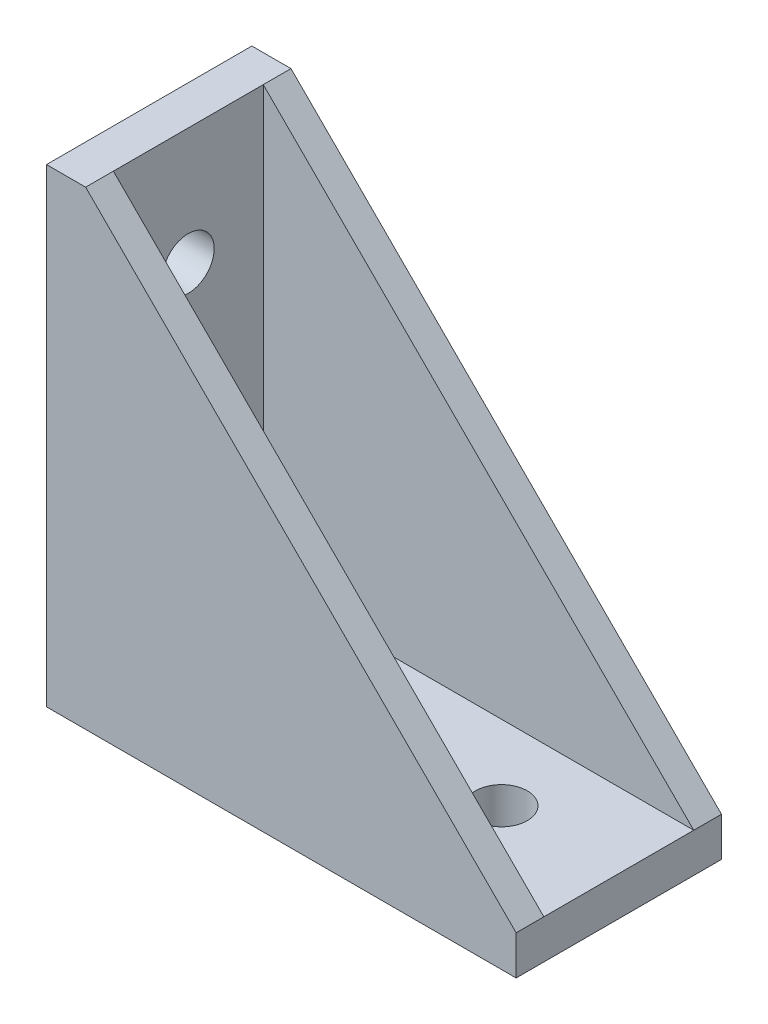
ISO-10303-21;
HEADER;
FILE_DESCRIPTION(('STEP AP214'),'2;1');
FILE_NAME('part.step','',(''),(''),'','','');
FILE_SCHEMA(('AUTOMOTIVE_DESIGN { 1 0 10303 214 1 1 1 1 }'));
ENDSEC;
DATA;
#1=APPLICATION_CONTEXT('core data for automotive mechanical design processes');
#2=APPLICATION_PROTOCOL_DEFINITION('international standard','automotive_design',2000,#1);
#3=PRODUCT_CONTEXT('',#1,'mechanical');
#4=PRODUCT('Part','Part','',(#3));
#5=PRODUCT_RELATED_PRODUCT_CATEGORY('part','',(#4));
#6=PRODUCT_DEFINITION_FORMATION('','',#4);
#7=PRODUCT_DEFINITION_CONTEXT('part definition',#1,'design');
#8=PRODUCT_DEFINITION('design','',#6,#7);
#9=PRODUCT_DEFINITION_SHAPE('','',#8);
#10=(LENGTH_UNIT() NAMED_UNIT(*) SI_UNIT(.MILLI.,.METRE.));
#11=(NAMED_UNIT(*) PLANE_ANGLE_UNIT() SI_UNIT($,.RADIAN.));
#12=(NAMED_UNIT(*) SI_UNIT($,.STERADIAN.) SOLID_ANGLE_UNIT());
#13=UNCERTAINTY_MEASURE_WITH_UNIT(LENGTH_MEASURE(1.E-05),#10,'distance_accuracy_value','');
#14=(GEOMETRIC_REPRESENTATION_CONTEXT(3) GLOBAL_UNCERTAINTY_ASSIGNED_CONTEXT((#13)) GLOBAL_UNIT_ASSIGNED_CONTEXT((#10,
#11,#12)) REPRESENTATION_CONTEXT('',''));
#15=CARTESIAN_POINT('',(0.,0.,0.));
#16=DIRECTION('',(0.,0.,1.));
#17=DIRECTION('',(1.,0.,0.));
#18=AXIS2_PLACEMENT_3D('',#15,#16,#17);
#19=CARTESIAN_POINT('',(76.2,6.35,16.66));
#20=DIRECTION('',(-0.707106781186548,-0.707106781186548,0.));
#21=DIRECTION('',(0.707106781186548,-0.707106781186548,0.));
#22=AXIS2_PLACEMENT_3D('',#19,#20,#21);
#23=PLANE('',#22);
#24=DIRECTION('',(-0.707106781186548,0.707106781186548,0.));
#25=VECTOR('',#24,1.);
#26=CARTESIAN_POINT('',(76.2,6.35,-12.16));
#27=LINE('',#26,#25);
#28=CARTESIAN_POINT('',(76.2,6.35000000000001,-12.16));
#29=VERTEX_POINT('',#28);
#30=CARTESIAN_POINT('',(6.35,76.2,-12.16));
#31=VERTEX_POINT('',#30);
#32=EDGE_CURVE('E11',#29,#31,#27,.T.);
#33=ORIENTED_EDGE('',*,*,#32,.F.);
#34=DIRECTION('',(0.,0.,-1.));
#35=VECTOR('',#34,1.);
#36=CARTESIAN_POINT('',(76.2,6.35,16.66));
#37=LINE('',#36,#35);
#38=CARTESIAN_POINT('',(76.2,6.35,-16.66));
#39=VERTEX_POINT('',#38);
#40=EDGE_CURVE('E122',#29,#39,#37,.T.);
#41=ORIENTED_EDGE('',*,*,#40,.T.);
#42=DIRECTION('',(-0.707106781186547,0.707106781186547,0.));
#43=VECTOR('',#42,1.);
#44=CARTESIAN_POINT('',(76.2,6.35,-16.66));
#45=LINE('',#44,#43);
#46=CARTESIAN_POINT('',(6.35,76.2,-16.66));
#47=VERTEX_POINT('',#46);
#48=EDGE_CURVE('E139',#39,#47,#45,.T.);
#49=ORIENTED_EDGE('',*,*,#48,.T.);
#50=DIRECTION('',(0.,0.,-1.));
#51=VECTOR('',#50,1.);
#52=CARTESIAN_POINT('',(6.35,76.2,16.66));
#53=LINE('',#52,#51);
#54=EDGE_CURVE('E145',#31,#47,#53,.T.);
#55=ORIENTED_EDGE('',*,*,#54,.F.);
#56=EDGE_LOOP('',(#33,#41,#49,#55));
#57=FACE_BOUND('',#56,.T.);
#58=ADVANCED_FACE('F39',(#57),#23,.F.);
#59=CARTESIAN_POINT('',(0.,76.2,16.66));
#60=DIRECTION('',(1.,0.,0.));
#61=DIRECTION('',(0.,0.,-1.));
#62=AXIS2_PLACEMENT_3D('',#59,#60,#61);
#63=PLANE('',#62);
#64=CARTESIAN_POINT('',(0.,19.05,0.));
#65=DIRECTION('',(1.,0.,0.));
#66=DIRECTION('',(0.,0.,-1.));
#67=AXIS2_PLACEMENT_3D('',#64,#65,#66);
#68=CIRCLE('',#67,4.2);
#69=CARTESIAN_POINT('',(0.,19.05,-4.2));
#70=VERTEX_POINT('',#69);
#71=EDGE_CURVE('E182',#70,#70,#68,.T.);
#72=ORIENTED_EDGE('',*,*,#71,.T.);
#73=EDGE_LOOP('',(#72));
#74=FACE_BOUND('',#73,.T.);
#75=CARTESIAN_POINT('',(0.,57.15,0.));
#76=DIRECTION('',(1.,0.,0.));
#77=DIRECTION('',(0.,0.,-1.));
#78=AXIS2_PLACEMENT_3D('',#75,#76,#77);
#79=CIRCLE('',#78,4.2);
#80=CARTESIAN_POINT('',(0.,57.15,-4.2));
#81=VERTEX_POINT('',#80);
#82=EDGE_CURVE('E190',#81,#81,#79,.T.);
#83=ORIENTED_EDGE('',*,*,#82,.T.);
#84=EDGE_LOOP('',(#83));
#85=FACE_BOUND('',#84,.T.);
#86=DIRECTION('',(0.,-1.,0.));
#87=VECTOR('',#86,1.);
#88=CARTESIAN_POINT('',(0.,76.2,-16.66));
#89=LINE('',#88,#87);
#90=CARTESIAN_POINT('',(0.,76.2,-16.66));
#91=VERTEX_POINT('',#90);
#92=CARTESIAN_POINT('',(0.,0.,-16.66));
#93=VERTEX_POINT('',#92);
#94=EDGE_CURVE('E131',#91,#93,#89,.T.);
#95=ORIENTED_EDGE('',*,*,#94,.T.);
#96=DIRECTION('',(0.,0.,-1.));
#97=VECTOR('',#96,1.);
#98=CARTESIAN_POINT('',(0.,0.,16.66));
#99=LINE('',#98,#97);
#100=CARTESIAN_POINT('',(0.,0.,16.66));
#101=VERTEX_POINT('',#100);
#102=EDGE_CURVE('E149',#101,#93,#99,.T.);
#103=ORIENTED_EDGE('',*,*,#102,.F.);
#104=DIRECTION('',(0.,-1.,0.));
#105=VECTOR('',#104,1.);
#106=CARTESIAN_POINT('',(0.,76.2,16.66));
#107=LINE('',#106,#105);
#108=CARTESIAN_POINT('',(0.,76.2,16.66));
#109=VERTEX_POINT('',#108);
#110=EDGE_CURVE('E143',#109,#101,#107,.T.);
#111=ORIENTED_EDGE('',*,*,#110,.F.);
#112=DIRECTION('',(0.,0.,-1.));
#113=VECTOR('',#112,1.);
#114=CARTESIAN_POINT('',(0.,76.2,16.66));
#115=LINE('',#114,#113);
#116=EDGE_CURVE('E127',#109,#91,#115,.T.);
#117=ORIENTED_EDGE('',*,*,#116,.T.);
#118=EDGE_LOOP('',(#95,#103,#111,#117));
#119=FACE_BOUND('',#118,.T.);
#120=ADVANCED_FACE('F41',(#74,#85,#119),#63,.F.);
#121=CARTESIAN_POINT('',(0.,0.,16.66));
#122=DIRECTION('',(0.,1.,0.));
#123=DIRECTION('',(0.,0.,1.));
#124=AXIS2_PLACEMENT_3D('',#121,#122,#123);
#125=PLANE('',#124);
#126=CARTESIAN_POINT('',(19.05,0.,0.));
#127=DIRECTION('',(0.,1.,0.));
#128=DIRECTION('',(0.,0.,1.));
#129=AXIS2_PLACEMENT_3D('',#126,#127,#128);
#130=CIRCLE('',#129,4.2);
#131=CARTESIAN_POINT('',(19.05,0.,4.2));
#132=VERTEX_POINT('',#131);
#133=EDGE_CURVE('E174',#132,#132,#130,.T.);
#134=ORIENTED_EDGE('',*,*,#133,.T.);
#135=EDGE_LOOP('',(#134));
#136=FACE_BOUND('',#135,.T.);
#137=CARTESIAN_POINT('',(57.15,0.,0.));
#138=DIRECTION('',(0.,1.,0.));
#139=DIRECTION('',(0.,0.,1.));
#140=AXIS2_PLACEMENT_3D('',#137,#138,#139);
#141=CIRCLE('',#140,4.2);
#142=CARTESIAN_POINT('',(57.15,0.,4.2));
#143=VERTEX_POINT('',#142);
#144=EDGE_CURVE('E178',#143,#143,#141,.T.);
#145=ORIENTED_EDGE('',*,*,#144,.T.);
#146=EDGE_LOOP('',(#145));
#147=FACE_BOUND('',#146,.T.);
#148=DIRECTION('',(1.,0.,0.));
#149=VECTOR('',#148,1.);
#150=CARTESIAN_POINT('',(0.,0.,-16.66));
#151=LINE('',#150,#149);
#152=CARTESIAN_POINT('',(76.2,0.,-16.66));
#153=VERTEX_POINT('',#152);
#154=EDGE_CURVE('E134',#93,#153,#151,.T.);
#155=ORIENTED_EDGE('',*,*,#154,.T.);
#156=DIRECTION('',(0.,0.,-1.));
#157=VECTOR('',#156,1.);
#158=CARTESIAN_POINT('',(76.2,0.,16.66));
#159=LINE('',#158,#157);
#160=CARTESIAN_POINT('',(76.2,0.,16.66));
#161=VERTEX_POINT('',#160);
#162=EDGE_CURVE('E120',#161,#153,#159,.T.);
#163=ORIENTED_EDGE('',*,*,#162,.F.);
#164=DIRECTION('',(1.,0.,0.));
#165=VECTOR('',#164,1.);
#166=CARTESIAN_POINT('',(0.,0.,16.66));
#167=LINE('',#166,#165);
#168=EDGE_CURVE('E94',#101,#161,#167,.T.);
#169=ORIENTED_EDGE('',*,*,#168,.F.);
#170=ORIENTED_EDGE('',*,*,#102,.T.);
#171=EDGE_LOOP('',(#155,#163,#169,#170));
#172=FACE_BOUND('',#171,.T.);
#173=ADVANCED_FACE('F241',(#136,#147,#172),#125,.F.);
#174=CARTESIAN_POINT('',(76.2,0.,16.66));
#175=DIRECTION('',(-1.,0.,0.));
#176=DIRECTION('',(0.,0.,1.));
#177=AXIS2_PLACEMENT_3D('',#174,#175,#176);
#178=PLANE('',#177);
#179=DIRECTION('',(0.,1.,0.));
#180=VECTOR('',#179,1.);
#181=CARTESIAN_POINT('',(76.2,0.,-16.66));
#182=LINE('',#181,#180);
#183=EDGE_CURVE('E137',#153,#39,#182,.T.);
#184=ORIENTED_EDGE('',*,*,#183,.T.);
#185=ORIENTED_EDGE('',*,*,#40,.F.);
#186=CARTESIAN_POINT('',(76.2,6.35000000000001,12.16));
#187=VERTEX_POINT('',#186);
#188=EDGE_CURVE('E117',#187,#29,#37,.T.);
#189=ORIENTED_EDGE('',*,*,#188,.F.);
#190=CARTESIAN_POINT('',(76.2,6.35,16.66));
#191=VERTEX_POINT('',#190);
#192=EDGE_CURVE('E111',#191,#187,#37,.T.);
#193=ORIENTED_EDGE('',*,*,#192,.F.);
#194=DIRECTION('',(0.,1.,0.));
#195=VECTOR('',#194,1.);
#196=CARTESIAN_POINT('',(76.2,0.,16.66));
#197=LINE('',#196,#195);
#198=EDGE_CURVE('E100',#161,#191,#197,.T.);
#199=ORIENTED_EDGE('',*,*,#198,.F.);
#200=ORIENTED_EDGE('',*,*,#162,.T.);
#201=EDGE_LOOP('',(#184,#185,#189,#193,#199,#200));
#202=FACE_BOUND('',#201,.T.);
#203=ADVANCED_FACE('F113',(#202),#178,.F.);
#204=ORIENTED_EDGE('',*,*,#192,.T.);
#205=DIRECTION('',(-0.707106781186548,0.707106781186548,0.));
#206=VECTOR('',#205,1.);
#207=CARTESIAN_POINT('',(76.2,6.35,12.16));
#208=LINE('',#207,#206);
#209=CARTESIAN_POINT('',(6.35,76.2,12.16));
#210=VERTEX_POINT('',#209);
#211=EDGE_CURVE('E47',#187,#210,#208,.T.);
#212=ORIENTED_EDGE('',*,*,#211,.T.);
#213=CARTESIAN_POINT('',(6.35,76.2,16.66));
#214=VERTEX_POINT('',#213);
#215=EDGE_CURVE('E125',#214,#210,#53,.T.);
#216=ORIENTED_EDGE('',*,*,#215,.F.);
#217=DIRECTION('',(-0.707106781186547,0.707106781186547,0.));
#218=VECTOR('',#217,1.);
#219=CARTESIAN_POINT('',(76.2,6.35,16.66));
#220=LINE('',#219,#218);
#221=EDGE_CURVE('E104',#191,#214,#220,.T.);
#222=ORIENTED_EDGE('',*,*,#221,.F.);
#223=EDGE_LOOP('',(#204,#212,#216,#222));
#224=FACE_BOUND('',#223,.T.);
#225=ADVANCED_FACE('F123',(#224),#23,.F.);
#226=CARTESIAN_POINT('',(6.35,76.2,16.66));
#227=DIRECTION('',(0.,-1.,0.));
#228=DIRECTION('',(0.,0.,-1.));
#229=AXIS2_PLACEMENT_3D('',#226,#227,#228);
#230=PLANE('',#229);
#231=DIRECTION('',(-1.,0.,0.));
#232=VECTOR('',#231,1.);
#233=CARTESIAN_POINT('',(6.35,76.2,-16.66));
#234=LINE('',#233,#232);
#235=EDGE_CURVE('E85',#47,#91,#234,.T.);
#236=ORIENTED_EDGE('',*,*,#235,.T.);
#237=ORIENTED_EDGE('',*,*,#116,.F.);
#238=DIRECTION('',(-1.,0.,0.));
#239=VECTOR('',#238,1.);
#240=CARTESIAN_POINT('',(6.35,76.2,16.66));
#241=LINE('',#240,#239);
#242=EDGE_CURVE('E62',#214,#109,#241,.T.);
#243=ORIENTED_EDGE('',*,*,#242,.F.);
#244=ORIENTED_EDGE('',*,*,#215,.T.);
#245=EDGE_CURVE('E146',#210,#31,#53,.T.);
#246=ORIENTED_EDGE('',*,*,#245,.T.);
#247=ORIENTED_EDGE('',*,*,#54,.T.);
#248=EDGE_LOOP('',(#236,#237,#243,#244,#246,#247));
#249=FACE_BOUND('',#248,.T.);
#250=ADVANCED_FACE('F159',(#249),#230,.F.);
#251=CARTESIAN_POINT('',(0.,0.,16.66));
#252=DIRECTION('',(0.,0.,1.));
#253=DIRECTION('',(1.,0.,0.));
#254=AXIS2_PLACEMENT_3D('',#251,#252,#253);
#255=PLANE('',#254);
#256=ORIENTED_EDGE('',*,*,#110,.T.);
#257=ORIENTED_EDGE('',*,*,#168,.T.);
#258=ORIENTED_EDGE('',*,*,#198,.T.);
#259=ORIENTED_EDGE('',*,*,#221,.T.);
#260=ORIENTED_EDGE('',*,*,#242,.T.);
#261=EDGE_LOOP('',(#256,#257,#258,#259,#260));
#262=FACE_BOUND('',#261,.T.);
#263=ADVANCED_FACE('F102',(#262),#255,.T.);
#264=CARTESIAN_POINT('',(0.,0.,-16.66));
#265=DIRECTION('',(0.,0.,1.));
#266=DIRECTION('',(1.,0.,0.));
#267=AXIS2_PLACEMENT_3D('',#264,#265,#266);
#268=PLANE('',#267);
#269=ORIENTED_EDGE('',*,*,#94,.F.);
#270=ORIENTED_EDGE('',*,*,#235,.F.);
#271=ORIENTED_EDGE('',*,*,#48,.F.);
#272=ORIENTED_EDGE('',*,*,#183,.F.);
#273=ORIENTED_EDGE('',*,*,#154,.F.);
#274=EDGE_LOOP('',(#269,#270,#271,#272,#273));
#275=FACE_BOUND('',#274,.T.);
#276=ADVANCED_FACE('F261',(#275),#268,.F.);
#277=CARTESIAN_POINT('',(6.35,6.35,-12.16));
#278=DIRECTION('',(0.,-1.,0.));
#279=DIRECTION('',(0.,0.,-1.));
#280=AXIS2_PLACEMENT_3D('',#277,#278,#279);
#281=PLANE('',#280);
#282=CARTESIAN_POINT('',(19.05,6.35,0.));
#283=DIRECTION('',(0.,1.,0.));
#284=DIRECTION('',(0.,0.,1.));
#285=AXIS2_PLACEMENT_3D('',#282,#283,#284);
#286=CIRCLE('',#285,4.2);
#287=CARTESIAN_POINT('',(19.05,6.35,4.2));
#288=VERTEX_POINT('',#287);
#289=EDGE_CURVE('E185',#288,#288,#286,.T.);
#290=ORIENTED_EDGE('',*,*,#289,.F.);
#291=EDGE_LOOP('',(#290));
#292=FACE_BOUND('',#291,.T.);
#293=CARTESIAN_POINT('',(57.15,6.35,0.));
#294=DIRECTION('',(0.,1.,0.));
#295=DIRECTION('',(0.,0.,1.));
#296=AXIS2_PLACEMENT_3D('',#293,#294,#295);
#297=CIRCLE('',#296,4.2);
#298=CARTESIAN_POINT('',(57.15,6.35,4.2));
#299=VERTEX_POINT('',#298);
#300=EDGE_CURVE('E181',#299,#299,#297,.T.);
#301=ORIENTED_EDGE('',*,*,#300,.F.);
#302=EDGE_LOOP('',(#301));
#303=FACE_BOUND('',#302,.T.);
#304=DIRECTION('',(1.,0.,0.));
#305=VECTOR('',#304,1.);
#306=CARTESIAN_POINT('',(6.35,6.35,-12.16));
#307=LINE('',#306,#305);
#308=CARTESIAN_POINT('',(6.35,6.35,-12.16));
#309=VERTEX_POINT('',#308);
#310=EDGE_CURVE('E168',#309,#29,#307,.T.);
#311=ORIENTED_EDGE('',*,*,#310,.F.);
#312=DIRECTION('',(0.,0.,1.));
#313=VECTOR('',#312,1.);
#314=CARTESIAN_POINT('',(6.35,6.35,-12.16));
#315=LINE('',#314,#313);
#316=CARTESIAN_POINT('',(6.35,6.35,12.16));
#317=VERTEX_POINT('',#316);
#318=EDGE_CURVE('E135',#309,#317,#315,.T.);
#319=ORIENTED_EDGE('',*,*,#318,.T.);
#320=DIRECTION('',(1.,0.,0.));
#321=VECTOR('',#320,1.);
#322=CARTESIAN_POINT('',(6.35,6.35,12.16));
#323=LINE('',#322,#321);
#324=EDGE_CURVE('E169',#317,#187,#323,.T.);
#325=ORIENTED_EDGE('',*,*,#324,.T.);
#326=ORIENTED_EDGE('',*,*,#188,.T.);
#327=EDGE_LOOP('',(#311,#319,#325,#326));
#328=FACE_BOUND('',#327,.T.);
#329=ADVANCED_FACE('F222',(#292,#303,#328),#281,.F.);
#330=CARTESIAN_POINT('',(0.,0.,-12.16));
#331=DIRECTION('',(0.,0.,1.));
#332=DIRECTION('',(1.,0.,0.));
#333=AXIS2_PLACEMENT_3D('',#330,#331,#332);
#334=PLANE('',#333);
#335=ORIENTED_EDGE('',*,*,#32,.T.);
#336=DIRECTION('',(0.,-1.,0.));
#337=VECTOR('',#336,1.);
#338=CARTESIAN_POINT('',(6.35,86.2,-12.16));
#339=LINE('',#338,#337);
#340=EDGE_CURVE('E54',#31,#309,#339,.T.);
#341=ORIENTED_EDGE('',*,*,#340,.T.);
#342=ORIENTED_EDGE('',*,*,#310,.T.);
#343=EDGE_LOOP('',(#335,#341,#342));
#344=FACE_BOUND('',#343,.T.);
#345=ADVANCED_FACE('F224',(#344),#334,.T.);
#346=CARTESIAN_POINT('',(0.,0.,12.16));
#347=DIRECTION('',(0.,0.,1.));
#348=DIRECTION('',(1.,0.,0.));
#349=AXIS2_PLACEMENT_3D('',#346,#347,#348);
#350=PLANE('',#349);
#351=ORIENTED_EDGE('',*,*,#324,.F.);
#352=DIRECTION('',(0.,-1.,0.));
#353=VECTOR('',#352,1.);
#354=CARTESIAN_POINT('',(6.35,86.2,12.16));
#355=LINE('',#354,#353);
#356=EDGE_CURVE('E171',#210,#317,#355,.T.);
#357=ORIENTED_EDGE('',*,*,#356,.F.);
#358=ORIENTED_EDGE('',*,*,#211,.F.);
#359=EDGE_LOOP('',(#351,#357,#358));
#360=FACE_BOUND('',#359,.T.);
#361=ADVANCED_FACE('F215',(#360),#350,.F.);
#362=CARTESIAN_POINT('',(6.35,86.2,-12.16));
#363=DIRECTION('',(-1.,0.,0.));
#364=DIRECTION('',(0.,0.,1.));
#365=AXIS2_PLACEMENT_3D('',#362,#363,#364);
#366=PLANE('',#365);
#367=CARTESIAN_POINT('',(6.35,19.05,0.));
#368=DIRECTION('',(1.,0.,0.));
#369=DIRECTION('',(0.,0.,-1.));
#370=AXIS2_PLACEMENT_3D('',#367,#368,#369);
#371=CIRCLE('',#370,4.2);
#372=CARTESIAN_POINT('',(6.35,19.05,-4.2));
#373=VERTEX_POINT('',#372);
#374=EDGE_CURVE('E196',#373,#373,#371,.T.);
#375=ORIENTED_EDGE('',*,*,#374,.F.);
#376=EDGE_LOOP('',(#375));
#377=FACE_BOUND('',#376,.T.);
#378=CARTESIAN_POINT('',(6.35,57.15,0.));
#379=DIRECTION('',(1.,0.,0.));
#380=DIRECTION('',(0.,0.,-1.));
#381=AXIS2_PLACEMENT_3D('',#378,#379,#380);
#382=CIRCLE('',#381,4.2);
#383=CARTESIAN_POINT('',(6.35,57.15,-4.2));
#384=VERTEX_POINT('',#383);
#385=EDGE_CURVE('E193',#384,#384,#382,.T.);
#386=ORIENTED_EDGE('',*,*,#385,.F.);
#387=EDGE_LOOP('',(#386));
#388=FACE_BOUND('',#387,.T.);
#389=ORIENTED_EDGE('',*,*,#356,.T.);
#390=ORIENTED_EDGE('',*,*,#318,.F.);
#391=ORIENTED_EDGE('',*,*,#340,.F.);
#392=ORIENTED_EDGE('',*,*,#245,.F.);
#393=EDGE_LOOP('',(#389,#390,#391,#392));
#394=FACE_BOUND('',#393,.T.);
#395=ADVANCED_FACE('F211',(#377,#388,#394),#366,.F.);
#396=CARTESIAN_POINT('',(57.15,0.,0.));
#397=DIRECTION('',(0.,1.,0.));
#398=DIRECTION('',(0.,0.,1.));
#399=AXIS2_PLACEMENT_3D('',#396,#397,#398);
#400=CYLINDRICAL_SURFACE('',#399,4.2);
#401=ORIENTED_EDGE('',*,*,#144,.F.);
#402=EDGE_LOOP('',(#401));
#403=FACE_BOUND('',#402,.T.);
#404=ORIENTED_EDGE('',*,*,#300,.T.);
#405=EDGE_LOOP('',(#404));
#406=FACE_BOUND('',#405,.T.);
#407=ADVANCED_FACE('F214',(#403,#406),#400,.F.);
#408=CARTESIAN_POINT('',(19.05,0.,0.));
#409=DIRECTION('',(0.,1.,0.));
#410=DIRECTION('',(0.,0.,1.));
#411=AXIS2_PLACEMENT_3D('',#408,#409,#410);
#412=CYLINDRICAL_SURFACE('',#411,4.2);
#413=ORIENTED_EDGE('',*,*,#133,.F.);
#414=EDGE_LOOP('',(#413));
#415=FACE_BOUND('',#414,.T.);
#416=ORIENTED_EDGE('',*,*,#289,.T.);
#417=EDGE_LOOP('',(#416));
#418=FACE_BOUND('',#417,.T.);
#419=ADVANCED_FACE('F317',(#415,#418),#412,.F.);
#420=CARTESIAN_POINT('',(0.,57.15,0.));
#421=DIRECTION('',(1.,0.,0.));
#422=DIRECTION('',(0.,0.,-1.));
#423=AXIS2_PLACEMENT_3D('',#420,#421,#422);
#424=CYLINDRICAL_SURFACE('',#423,4.2);
#425=ORIENTED_EDGE('',*,*,#82,.F.);
#426=EDGE_LOOP('',(#425));
#427=FACE_BOUND('',#426,.T.);
#428=ORIENTED_EDGE('',*,*,#385,.T.);
#429=EDGE_LOOP('',(#428));
#430=FACE_BOUND('',#429,.T.);
#431=ADVANCED_FACE('F207',(#427,#430),#424,.F.);
#432=CARTESIAN_POINT('',(0.,19.05,0.));
#433=DIRECTION('',(1.,0.,0.));
#434=DIRECTION('',(0.,0.,-1.));
#435=AXIS2_PLACEMENT_3D('',#432,#433,#434);
#436=CYLINDRICAL_SURFACE('',#435,4.2);
#437=ORIENTED_EDGE('',*,*,#71,.F.);
#438=EDGE_LOOP('',(#437));
#439=FACE_BOUND('',#438,.T.);
#440=ORIENTED_EDGE('',*,*,#374,.T.);
#441=EDGE_LOOP('',(#440));
#442=FACE_BOUND('',#441,.T.);
#443=ADVANCED_FACE('F204',(#439,#442),#436,.F.);
#444=CLOSED_SHELL('',(#58,#120,#173,#203,#225,#250,#263,#276,#329,#345,#361,#395,#407,#419,#431,#443));
#445=MANIFOLD_SOLID_BREP('B2',#444);
#446=ADVANCED_BREP_SHAPE_REPRESENTATION('',(#18,#445),#14);
#447=SHAPE_DEFINITION_REPRESENTATION(#9,#446);
ENDSEC;
END-ISO-10303-21;
